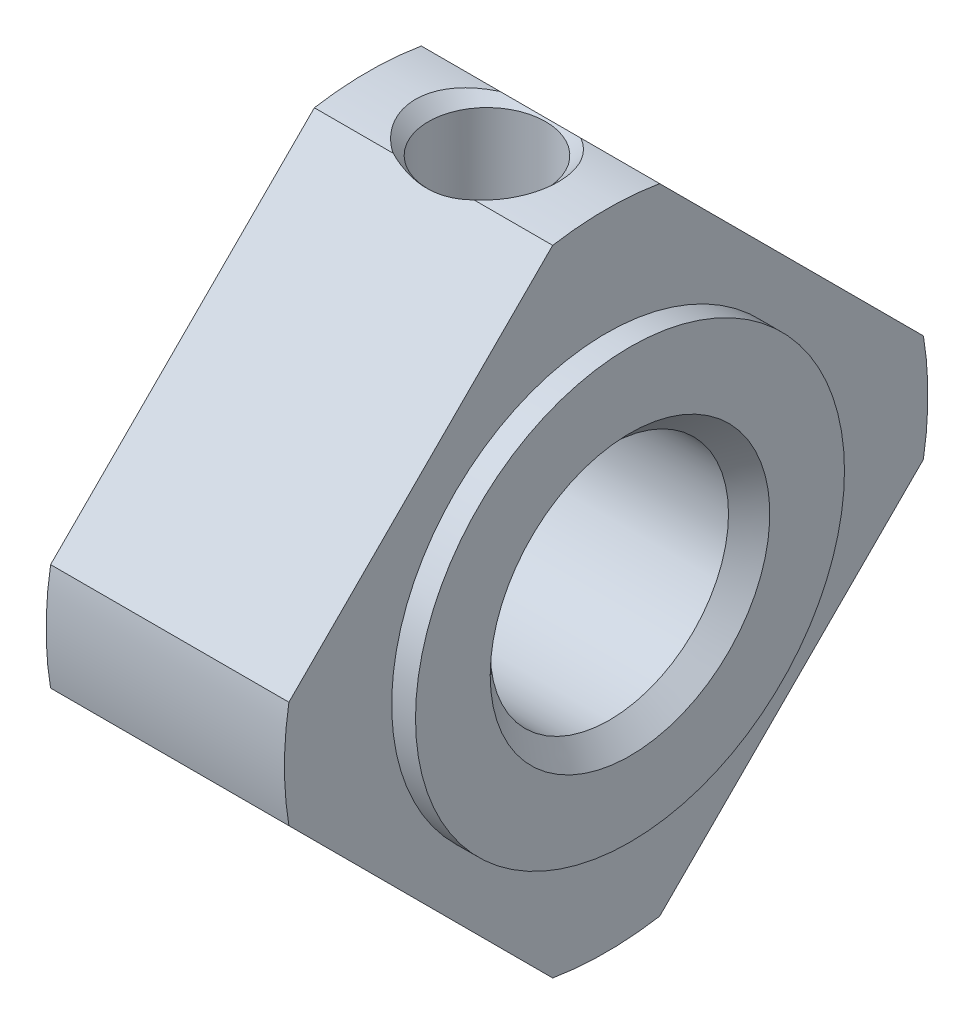
ISO-10303-21;
HEADER;
FILE_DESCRIPTION(('STEP AP214'),'2;1');
FILE_NAME('part.step','',(''),(''),'','','');
FILE_SCHEMA(('AUTOMOTIVE_DESIGN { 1 0 10303 214 1 1 1 1 }'));
ENDSEC;
DATA;
#1=APPLICATION_CONTEXT('core data for automotive mechanical design processes');
#2=APPLICATION_PROTOCOL_DEFINITION('international standard','automotive_design',2000,#1);
#3=PRODUCT_CONTEXT('',#1,'mechanical');
#4=PRODUCT('Part','Part','',(#3));
#5=PRODUCT_RELATED_PRODUCT_CATEGORY('part','',(#4));
#6=PRODUCT_DEFINITION_FORMATION('','',#4);
#7=PRODUCT_DEFINITION_CONTEXT('part definition',#1,'design');
#8=PRODUCT_DEFINITION('design','',#6,#7);
#9=PRODUCT_DEFINITION_SHAPE('','',#8);
#10=(LENGTH_UNIT() NAMED_UNIT(*) SI_UNIT(.MILLI.,.METRE.));
#11=(NAMED_UNIT(*) PLANE_ANGLE_UNIT() SI_UNIT($,.RADIAN.));
#12=(NAMED_UNIT(*) SI_UNIT($,.STERADIAN.) SOLID_ANGLE_UNIT());
#13=UNCERTAINTY_MEASURE_WITH_UNIT(LENGTH_MEASURE(1.E-05),#10,'distance_accuracy_value','');
#14=(GEOMETRIC_REPRESENTATION_CONTEXT(3) GLOBAL_UNCERTAINTY_ASSIGNED_CONTEXT((#13)) GLOBAL_UNIT_ASSIGNED_CONTEXT((#10,
#11,#12)) REPRESENTATION_CONTEXT('',''));
#15=CARTESIAN_POINT('',(0.,0.,0.));
#16=DIRECTION('',(0.,0.,1.));
#17=DIRECTION('',(1.,0.,0.));
#18=AXIS2_PLACEMENT_3D('',#15,#16,#17);
#19=CARTESIAN_POINT('',(5.5,0.,0.));
#20=DIRECTION('',(1.,0.,0.));
#21=DIRECTION('',(0.,0.,-1.));
#22=AXIS2_PLACEMENT_3D('',#19,#20,#21);
#23=CYLINDRICAL_SURFACE('',#22,6.75);
#24=DIRECTION('',(-1.,0.,0.));
#25=VECTOR('',#24,1.);
#26=CARTESIAN_POINT('',(1.65267128542053,6.65608024917335,1.12209434387866));
#27=LINE('',#26,#25);
#28=CARTESIAN_POINT('',(1.65267128542052,6.65608024917335,1.12209434387866));
#29=VERTEX_POINT('',#28);
#30=CARTESIAN_POINT('',(0.,6.65608024917335,1.12209434387865));
#31=VERTEX_POINT('',#30);
#32=EDGE_CURVE('E157',#29,#31,#27,.T.);
#33=ORIENTED_EDGE('',*,*,#32,.F.);
#34=CARTESIAN_POINT('',(2.24603879819354,6.61534751855395,-1.34152058408303));
#35=CARTESIAN_POINT('',(2.15785318177017,6.61815551437171,-1.32767978026441));
#36=CARTESIAN_POINT('',(2.070798662778,6.62239785722063,-1.30659028024299));
#37=CARTESIAN_POINT('',(1.90146823740733,6.63326374287677,-1.25025065235848));
#38=CARTESIAN_POINT('',(1.81919733519108,6.639889728955,-1.21498599036703));
#39=CARTESIAN_POINT('',(1.66224684439875,6.65470509446009,-1.1310209402988));
#40=CARTESIAN_POINT('',(1.58754623527447,6.66288995235655,-1.08235923301763));
#41=CARTESIAN_POINT('',(1.44810106425627,6.67981298110851,-0.972459114140487));
#42=CARTESIAN_POINT('',(1.3833525854404,6.68855093235808,-0.91122567275819));
#43=CARTESIAN_POINT('',(1.26995138541579,6.70491185353518,-0.781455920749189));
#44=CARTESIAN_POINT('',(1.2205795824979,6.71257013615754,-0.713554799184198));
#45=CARTESIAN_POINT('',(1.13543304769278,6.72631468537572,-0.569556578233745));
#46=CARTESIAN_POINT('',(1.09964621172735,6.73240234982073,-0.493466852783167));
#47=CARTESIAN_POINT('',(1.04661821703989,6.74161124659177,-0.343805224457489));
#48=CARTESIAN_POINT('',(1.02783581680782,6.74497507652447,-0.270793929020345));
#49=CARTESIAN_POINT('',(1.00383843306935,6.74929438075554,-0.1225148994005));
#50=CARTESIAN_POINT('',(0.99861518373358,6.75025132231235,-0.0472485682404582));
#51=CARTESIAN_POINT('',(1.00187512401968,6.74965950324262,0.0966900064147446));
#52=CARTESIAN_POINT('',(1.00925627914023,6.74831219353963,0.165390873345387));
#53=CARTESIAN_POINT('',(1.03528869157911,6.74364492933586,0.300541519974863));
#54=CARTESIAN_POINT('',(1.05393954081505,6.74032504626322,0.366991381091963));
#55=CARTESIAN_POINT('',(1.10167849841342,6.73206842345746,0.495918928168141));
#56=CARTESIAN_POINT('',(1.13076992001332,6.72713117050755,0.558395345767164));
#57=CARTESIAN_POINT('',(1.19824470594226,6.71613322382673,0.67798745427871));
#58=CARTESIAN_POINT('',(1.23663052632886,6.71007223324597,0.735101722690727));
#59=CARTESIAN_POINT('',(1.3246340991189,6.69690089303173,0.847013621908955));
#60=CARTESIAN_POINT('',(1.37488142002905,6.68974585693174,0.901310042844061));
#61=CARTESIAN_POINT('',(1.4830676244556,6.67546770454741,1.00159995528784));
#62=CARTESIAN_POINT('',(1.54100965602629,6.66834460256757,1.04759003023828));
#63=CARTESIAN_POINT('',(1.66916081351861,6.65409168785639,1.13477336476352));
#64=CARTESIAN_POINT('',(1.74001719023289,6.64703235540264,1.17502782844539));
#65=CARTESIAN_POINT('',(1.88722547518565,6.63445140224846,1.24410201464943));
#66=CARTESIAN_POINT('',(1.96357927216084,6.6289303132421,1.27291778484392));
#67=CARTESIAN_POINT('',(2.12562506328205,6.61964824769282,1.3203755064781));
#68=CARTESIAN_POINT('',(2.21159122996102,6.61604605774744,1.3381162982316));
#69=CARTESIAN_POINT('',(2.38532642856748,6.61165647428634,1.35963938574428));
#70=CARTESIAN_POINT('',(2.4730957785583,6.61086958172317,1.36341919729776));
#71=CARTESIAN_POINT('',(2.65058632528991,6.61221926110084,1.35686049375444));
#72=CARTESIAN_POINT('',(2.74029234422787,6.61443931670505,1.34611882620944));
#73=CARTESIAN_POINT('',(2.91660266413806,6.62168962844541,1.30998556802453));
#74=CARTESIAN_POINT('',(3.00320658750766,6.62672022546611,1.2845922002991));
#75=CARTESIAN_POINT('',(3.17063896534817,6.63898041092013,1.21964154282177));
#76=CARTESIAN_POINT('',(3.2514754555141,6.64620686297645,1.18010444061909));
#77=CARTESIAN_POINT('',(3.40492192644532,6.66197693635722,1.08754720019126));
#78=CARTESIAN_POINT('',(3.47753225689844,6.67052050165569,1.03452763540652));
#79=CARTESIAN_POINT('',(3.60912601319374,6.68747359811197,0.918418838600742));
#80=CARTESIAN_POINT('',(3.66853702476329,6.69587491288897,0.85581482462203));
#81=CARTESIAN_POINT('',(3.77471514498373,6.71177429450737,0.720555298705765));
#82=CARTESIAN_POINT('',(3.82149151130774,6.71927302044905,0.647907205611915));
#83=CARTESIAN_POINT('',(3.89630734967352,6.7316848353749,0.501781389145373));
#84=CARTESIAN_POINT('',(3.92568006071767,6.73677297123661,0.429002435790604));
#85=CARTESIAN_POINT('',(3.97041223107033,6.74464095907994,0.279149017524704));
#86=CARTESIAN_POINT('',(3.98578328185477,6.74742272025536,0.202078161925788));
#87=CARTESIAN_POINT('',(4.00082204127642,6.7501469132674,0.0541878173701187));
#88=CARTESIAN_POINT('',(4.00190686250625,6.75034554880237,-0.0164857448617568));
#89=CARTESIAN_POINT('',(3.99196060217953,6.74854050922165,-0.15693626696342));
#90=CARTESIAN_POINT('',(3.9809318838276,6.74653726366619,-0.226713399029559));
#91=CARTESIAN_POINT('',(3.94785170860991,6.74065803258112,-0.361136214071014));
#92=CARTESIAN_POINT('',(3.926161469893,6.73684354787529,-0.425874488519602));
#93=CARTESIAN_POINT('',(3.87287364849635,6.72776531670228,-0.551012468439278));
#94=CARTESIAN_POINT('',(3.84127430273643,6.72250131234932,-0.61141139947928));
#95=CARTESIAN_POINT('',(3.76738531747084,6.71071632861456,-0.729735115456749));
#96=CARTESIAN_POINT('',(3.7246115514865,6.70414291760039,-0.787351414657744));
#97=CARTESIAN_POINT('',(3.63080091981482,6.69057831496146,-0.895337833955404));
#98=CARTESIAN_POINT('',(3.57976115906349,6.68358697750627,-0.945705403557404));
#99=CARTESIAN_POINT('',(3.46551945313485,6.66913314238332,-1.04298442893806));
#100=CARTESIAN_POINT('',(3.401616113719,6.66169148561867,-1.08907538653754));
#101=CARTESIAN_POINT('',(3.26739309494876,6.64779335331561,-1.17092756195501));
#102=CARTESIAN_POINT('',(3.19706976317422,6.64133744423409,-1.20668285087359));
#103=CARTESIAN_POINT('',(3.04541857843203,6.62953342641305,-1.27000740242151));
#104=CARTESIAN_POINT('',(2.96366605933838,6.62433136055336,-1.29658868716079));
#105=CARTESIAN_POINT('',(2.79692367246798,6.61639754093793,-1.3364890138674));
#106=CARTESIAN_POINT('',(2.71193597357157,6.61366416153218,-1.34981678396663));
#107=CARTESIAN_POINT('',(2.56302897761604,6.61130072556155,-1.36132941704121));
#108=CARTESIAN_POINT('',(2.49933593269377,6.61105160172571,-1.36253573196111));
#109=CARTESIAN_POINT('',(2.37225019424525,6.61207482800462,-1.35756122028006));
#110=CARTESIAN_POINT('',(2.30885751555298,6.6133472524927,-1.35138003257784));
#111=CARTESIAN_POINT('',(2.24603879819354,6.61534751855395,-1.34152058408303));
#112=B_SPLINE_CURVE_WITH_KNOTS('',3,(#34,#35,#36,#37,#38,#39,#40,#41,#42,#43,#44,#45,#46,#47,
#48,#49,#50,#51,#52,#53,#54,#55,#56,#57,#58,#59,#60,#61,#62,#63,#64,#65,#66,#67,#68,#69,#70,#71,
#72,#73,#74,#75,#76,#77,#78,#79,#80,#81,#82,#83,#84,#85,#86,#87,#88,#89,#90,#91,#92,#93,#94,#95,
#96,#97,#98,#99,#100,#101,#102,#103,#104,#105,#106,#107,#108,#109,#110,#111),.UNSPECIFIED.,.T.,
.F.,(4,2,2,2,2,2,2,2,2,2,2,2,2,2,2,2,2,2,2,2,2,2,2,2,2,2,2,2,2,2,2,2,2,2,2,2,2,2,4),(0.,
0.267700849767893,0.535676882545827,0.802887168670449,1.06999201638941,1.32150050643273,
1.57278437583772,1.79794464672769,2.02296762480854,2.22930698259912,2.43563886916529,
2.6420362915929,2.84848831445894,3.07054138836094,3.29268558994345,3.53703172670496,
3.78146221725689,4.04381955965843,4.30622358346827,4.5760641976223,4.84593754727292,
5.11542722982269,5.38490545226786,5.64364976461629,5.90220397202133,6.13683405320424,
6.37126971549661,6.58225273590439,6.79319460339387,6.99743675327198,7.20171526362097,
7.41699660106674,7.63235350189011,7.86878415887387,8.10535017279106,8.36258211026964,
8.61964453466982,8.81033098343672,9.00102675334229),.UNSPECIFIED.);
#113=CARTESIAN_POINT('',(1.65267128542052,6.65608024917335,-1.12209434387865));
#114=VERTEX_POINT('',#113);
#115=EDGE_CURVE('E143',#114,#29,#112,.T.);
#116=ORIENTED_EDGE('',*,*,#115,.F.);
#117=DIRECTION('',(1.,0.,0.));
#118=VECTOR('',#117,1.);
#119=CARTESIAN_POINT('',(0.,6.65608024917335,-1.12209434387866));
#120=LINE('',#119,#118);
#121=CARTESIAN_POINT('',(0.,6.65608024917335,-1.12209434387865));
#122=VERTEX_POINT('',#121);
#123=EDGE_CURVE('E156',#122,#114,#120,.T.);
#124=ORIENTED_EDGE('',*,*,#123,.F.);
#125=CARTESIAN_POINT('',(0.,0.,0.));
#126=DIRECTION('',(1.,0.,0.));
#127=DIRECTION('',(0.,0.986085962840496,-0.166236199093134));
#128=AXIS2_PLACEMENT_3D('',#125,#126,#127);
#129=CIRCLE('',#128,6.75);
#130=EDGE_CURVE('E167',#122,#31,#129,.T.);
#131=ORIENTED_EDGE('',*,*,#130,.T.);
#132=EDGE_LOOP('',(#33,#116,#124,#131));
#133=FACE_BOUND('',#132,.T.);
#134=ADVANCED_FACE('F63',(#133),#23,.T.);
#135=CARTESIAN_POINT('',(3.34732871457948,6.65608024917335,1.12209434387866));
#136=VERTEX_POINT('',#135);
#137=CARTESIAN_POINT('',(3.34732871457948,6.65608024917335,-1.12209434387866));
#138=VERTEX_POINT('',#137);
#139=EDGE_CURVE('E80',#136,#138,#112,.T.);
#140=ORIENTED_EDGE('',*,*,#139,.F.);
#141=CARTESIAN_POINT('',(5.,6.65608024917335,1.12209434387865));
#142=VERTEX_POINT('',#141);
#143=EDGE_CURVE('E175',#142,#136,#27,.T.);
#144=ORIENTED_EDGE('',*,*,#143,.F.);
#145=CARTESIAN_POINT('',(5.,0.,0.));
#146=DIRECTION('',(1.,0.,0.));
#147=DIRECTION('',(0.,0.986085962840496,-0.166236199093134));
#148=AXIS2_PLACEMENT_3D('',#145,#146,#147);
#149=CIRCLE('',#148,6.75);
#150=CARTESIAN_POINT('',(5.,6.65608024917335,-1.12209434387866));
#151=VERTEX_POINT('',#150);
#152=EDGE_CURVE('E353',#151,#142,#149,.T.);
#153=ORIENTED_EDGE('',*,*,#152,.F.);
#154=EDGE_CURVE('E168',#138,#151,#120,.T.);
#155=ORIENTED_EDGE('',*,*,#154,.F.);
#156=EDGE_LOOP('',(#140,#144,#153,#155));
#157=FACE_BOUND('',#156,.T.);
#158=ADVANCED_FACE('F226',(#157),#23,.T.);
#159=CARTESIAN_POINT('',(5.5,7.778174593052,0.));
#160=DIRECTION('',(0.,-0.707106781186548,-0.707106781186548));
#161=DIRECTION('',(0.,0.707106781186548,-0.707106781186548));
#162=AXIS2_PLACEMENT_3D('',#159,#160,#161);
#163=PLANE('',#162);
#164=ORIENTED_EDGE('',*,*,#143,.T.);
#165=CARTESIAN_POINT('',(3.34792524458136,6.65628024917537,1.12189434387663));
#166=CARTESIAN_POINT('',(3.29280423747889,6.63778277708909,1.14039181596291));
#167=CARTESIAN_POINT('',(3.2366458798352,6.62076058847088,1.15741400458112));
#168=CARTESIAN_POINT('',(3.12242892684439,6.59006400544893,1.18811058760307));
#169=CARTESIAN_POINT('',(3.06436735329143,6.57639517272365,1.20177942032835));
#170=CARTESIAN_POINT('',(2.94696988836248,6.55291987835453,1.22525471469747));
#171=CARTESIAN_POINT('',(2.88764100872699,6.54309610190582,1.23507849114618));
#172=CARTESIAN_POINT('',(2.76794412513807,6.52757870688341,1.25059588616859));
#173=CARTESIAN_POINT('',(2.70757685672463,6.52188227882422,1.25629231422778));
#174=CARTESIAN_POINT('',(2.5897629524755,6.51503373115983,1.26314086189217));
#175=CARTESIAN_POINT('',(2.53234408716051,6.51364296373287,1.26453162931913));
#176=CARTESIAN_POINT('',(2.41758431717266,6.51477955174215,1.26339504130985));
#177=CARTESIAN_POINT('',(2.36024341157082,6.51730686007279,1.26086773297922));
#178=CARTESIAN_POINT('',(2.24619286324717,6.52618435769526,1.25199023535674));
#179=CARTESIAN_POINT('',(2.18948290804976,6.5325325602534,1.2456420327986));
#180=CARTESIAN_POINT('',(2.07713140182352,6.5488280916779,1.2293465013741));
#181=CARTESIAN_POINT('',(2.02148954976025,6.55877439029409,1.21940020275791));
#182=CARTESIAN_POINT('',(1.9125876901768,6.58175304087115,1.19642155218085));
#183=CARTESIAN_POINT('',(1.85930292627979,6.59472740278011,1.1834471902719));
#184=CARTESIAN_POINT('',(1.75441588350486,6.62348307313419,1.15469151991781));
#185=CARTESIAN_POINT('',(1.7028097941963,6.63925741014971,1.13891718290229));
#186=CARTESIAN_POINT('',(1.65207475542466,6.65628024917335,1.12189434387865));
#187=B_SPLINE_CURVE_WITH_KNOTS('',3,(#165,#166,#167,#168,#169,#170,#171,#172,#173,#174,#175,
#176,#177,#178,#179,#180,#181,#182,#183,#184,#185,#186),.UNSPECIFIED.,.F.,.F.,(4,2,2,2,2,2,2,2,
2,2,4),(0.,0.18306054855765,0.36642268855752,0.548949353726212,0.731351655992747,
0.903444542413566,1.07553535984033,1.24753677316517,1.41948897590708,1.58838508246322,
1.75686642087156),.UNSPECIFIED.);
#188=EDGE_CURVE('E159',#136,#29,#187,.T.);
#189=ORIENTED_EDGE('',*,*,#188,.T.);
#190=ORIENTED_EDGE('',*,*,#32,.T.);
#191=DIRECTION('',(0.,-0.707106781186548,0.707106781186548));
#192=VECTOR('',#191,1.);
#193=CARTESIAN_POINT('',(0.,6.65608024917335,1.12209434387865));
#194=LINE('',#193,#192);
#195=CARTESIAN_POINT('',(0.,1.12209434387865,6.65608024917335));
#196=VERTEX_POINT('',#195);
#197=EDGE_CURVE('E173',#31,#196,#194,.T.);
#198=ORIENTED_EDGE('',*,*,#197,.T.);
#199=DIRECTION('',(1.,0.,0.));
#200=VECTOR('',#199,1.);
#201=CARTESIAN_POINT('',(0.,1.12209434387866,6.65608024917335));
#202=LINE('',#201,#200);
#203=CARTESIAN_POINT('',(5.,1.12209434387866,6.65608024917335));
#204=VERTEX_POINT('',#203);
#205=EDGE_CURVE('E264',#196,#204,#202,.T.);
#206=ORIENTED_EDGE('',*,*,#205,.T.);
#207=DIRECTION('',(0.,0.707106781186547,-0.707106781186548));
#208=VECTOR('',#207,1.);
#209=CARTESIAN_POINT('',(5.,1.12209434387865,6.65608024917335));
#210=LINE('',#209,#208);
#211=EDGE_CURVE('E266',#204,#142,#210,.T.);
#212=ORIENTED_EDGE('',*,*,#211,.T.);
#213=EDGE_LOOP('',(#164,#189,#190,#198,#206,#212));
#214=FACE_BOUND('',#213,.T.);
#215=ADVANCED_FACE('F230',(#214),#163,.F.);
#216=CARTESIAN_POINT('',(5.5,0.,-7.778174593052));
#217=DIRECTION('',(0.,-0.707106781186548,0.707106781186548));
#218=DIRECTION('',(0.,-0.707106781186548,-0.707106781186548));
#219=AXIS2_PLACEMENT_3D('',#216,#217,#218);
#220=PLANE('',#219);
#221=ORIENTED_EDGE('',*,*,#123,.T.);
#222=CARTESIAN_POINT('',(1.65207475542466,6.65628024917335,-1.12189434387865));
#223=CARTESIAN_POINT('',(1.70719576252703,6.63778277708724,-1.14039181596476));
#224=CARTESIAN_POINT('',(1.76335412017061,6.62076058846919,-1.15741400458281));
#225=CARTESIAN_POINT('',(1.87757107316119,6.59006400544756,-1.18811058760444));
#226=CARTESIAN_POINT('',(1.93563264671401,6.57639517272244,-1.20177942032956));
#227=CARTESIAN_POINT('',(2.05303011164268,6.55291987835362,-1.22525471469838));
#228=CARTESIAN_POINT('',(2.11235899127801,6.54309610190506,-1.23507849114694));
#229=CARTESIAN_POINT('',(2.23205587486659,6.52757870688292,-1.25059588616908));
#230=CARTESIAN_POINT('',(2.29242314327986,6.52188227882386,-1.25629231422814));
#231=CARTESIAN_POINT('',(2.41023704752867,6.51503373115969,-1.26314086189231));
#232=CARTESIAN_POINT('',(2.46765591284353,6.51364296373282,-1.26453162931918));
#233=CARTESIAN_POINT('',(2.58241568283109,6.51477955174227,-1.26339504130973));
#234=CARTESIAN_POINT('',(2.63975658843279,6.51730686007299,-1.26086773297901));
#235=CARTESIAN_POINT('',(2.75380713675615,6.52618435769559,-1.25199023535641));
#236=CARTESIAN_POINT('',(2.81051709195341,6.5325325602538,-1.2456420327982));
#237=CARTESIAN_POINT('',(2.92286859817935,6.54882809167838,-1.22934650137362));
#238=CARTESIAN_POINT('',(2.97851045024247,6.55877439029461,-1.21940020275739));
#239=CARTESIAN_POINT('',(3.08741230982639,6.58175304087188,-1.19642155218012));
#240=CARTESIAN_POINT('',(3.140697073724,6.59472740278105,-1.18344719027095));
#241=CARTESIAN_POINT('',(3.24558411650008,6.62348307313564,-1.15469151991636));
#242=CARTESIAN_POINT('',(3.29719020580919,6.63925741015143,-1.13891718290057));
#243=CARTESIAN_POINT('',(3.34792524458136,6.65628024917537,-1.12189434387663));
#244=B_SPLINE_CURVE_WITH_KNOTS('',3,(#222,#223,#224,#225,#226,#227,#228,#229,#230,#231,#232,
#233,#234,#235,#236,#237,#238,#239,#240,#241,#242,#243),.UNSPECIFIED.,.F.,.F.,(4,2,2,2,2,2,2,2,
2,2,4),(0.,0.183060548557078,0.366422688556371,0.548949353724461,0.731351655990396,
0.903444542410801,1.07553535983715,1.24753677316159,1.41948897590311,1.58838508246124,
1.75686642087156),.UNSPECIFIED.);
#245=EDGE_CURVE('E140',#114,#138,#244,.T.);
#246=ORIENTED_EDGE('',*,*,#245,.T.);
#247=ORIENTED_EDGE('',*,*,#154,.T.);
#248=DIRECTION('',(0.,-0.707106781186548,-0.707106781186548));
#249=VECTOR('',#248,1.);
#250=CARTESIAN_POINT('',(5.,6.65608024917335,-1.12209434387865));
#251=LINE('',#250,#249);
#252=CARTESIAN_POINT('',(5.,1.12209434387865,-6.65608024917335));
#253=VERTEX_POINT('',#252);
#254=EDGE_CURVE('E418',#151,#253,#251,.T.);
#255=ORIENTED_EDGE('',*,*,#254,.T.);
#256=DIRECTION('',(-1.,0.,0.));
#257=VECTOR('',#256,1.);
#258=CARTESIAN_POINT('',(5.,1.12209434387866,-6.65608024917335));
#259=LINE('',#258,#257);
#260=CARTESIAN_POINT('',(0.,1.12209434387865,-6.65608024917335));
#261=VERTEX_POINT('',#260);
#262=EDGE_CURVE('E281',#253,#261,#259,.T.);
#263=ORIENTED_EDGE('',*,*,#262,.T.);
#264=DIRECTION('',(0.,0.707106781186548,0.707106781186548));
#265=VECTOR('',#264,1.);
#266=CARTESIAN_POINT('',(0.,1.12209434387865,-6.65608024917335));
#267=LINE('',#266,#265);
#268=EDGE_CURVE('E165',#261,#122,#267,.T.);
#269=ORIENTED_EDGE('',*,*,#268,.T.);
#270=EDGE_LOOP('',(#221,#246,#247,#255,#263,#269));
#271=FACE_BOUND('',#270,.T.);
#272=ADVANCED_FACE('F162',(#271),#220,.F.);
#273=CARTESIAN_POINT('',(0.,6.75,0.));
#274=DIRECTION('',(-1.,0.,0.));
#275=DIRECTION('',(0.,0.,1.));
#276=AXIS2_PLACEMENT_3D('',#273,#274,#275);
#277=PLANE('',#276);
#278=CARTESIAN_POINT('',(0.,0.,0.));
#279=DIRECTION('',(-1.,0.,0.));
#280=DIRECTION('',(0.,0.,1.));
#281=AXIS2_PLACEMENT_3D('',#278,#279,#280);
#282=CIRCLE('',#281,2.93300000000002);
#283=CARTESIAN_POINT('',(0.,0.,2.93300000000002));
#284=VERTEX_POINT('',#283);
#285=EDGE_CURVE('E13',#284,#284,#282,.F.);
#286=ORIENTED_EDGE('',*,*,#285,.T.);
#287=EDGE_LOOP('',(#286));
#288=FACE_BOUND('',#287,.T.);
#289=ORIENTED_EDGE('',*,*,#197,.F.);
#290=ORIENTED_EDGE('',*,*,#130,.F.);
#291=ORIENTED_EDGE('',*,*,#268,.F.);
#292=CARTESIAN_POINT('',(0.,0.,0.));
#293=DIRECTION('',(1.,0.,0.));
#294=DIRECTION('',(0.,-0.166236199093134,-0.986085962840496));
#295=AXIS2_PLACEMENT_3D('',#292,#293,#294);
#296=CIRCLE('',#295,6.75);
#297=CARTESIAN_POINT('',(0.,-1.12209434387865,-6.65608024917335));
#298=VERTEX_POINT('',#297);
#299=EDGE_CURVE('E403',#298,#261,#296,.T.);
#300=ORIENTED_EDGE('',*,*,#299,.F.);
#301=DIRECTION('',(0.,0.707106781186548,-0.707106781186548));
#302=VECTOR('',#301,1.);
#303=CARTESIAN_POINT('',(0.,-6.65608024917335,-1.12209434387865));
#304=LINE('',#303,#302);
#305=CARTESIAN_POINT('',(0.,-6.65608024917335,-1.12209434387865));
#306=VERTEX_POINT('',#305);
#307=EDGE_CURVE('E397',#306,#298,#304,.T.);
#308=ORIENTED_EDGE('',*,*,#307,.F.);
#309=CARTESIAN_POINT('',(0.,0.,0.));
#310=DIRECTION('',(1.,0.,0.));
#311=DIRECTION('',(0.,-0.986085962840496,0.166236199093135));
#312=AXIS2_PLACEMENT_3D('',#309,#310,#311);
#313=CIRCLE('',#312,6.75);
#314=CARTESIAN_POINT('',(0.,-6.65608024917335,1.12209434387865));
#315=VERTEX_POINT('',#314);
#316=EDGE_CURVE('E391',#315,#306,#313,.T.);
#317=ORIENTED_EDGE('',*,*,#316,.F.);
#318=DIRECTION('',(0.,-0.707106781186548,-0.707106781186548));
#319=VECTOR('',#318,1.);
#320=CARTESIAN_POINT('',(0.,-1.12209434387865,6.65608024917335));
#321=LINE('',#320,#319);
#322=CARTESIAN_POINT('',(0.,-1.12209434387865,6.65608024917335));
#323=VERTEX_POINT('',#322);
#324=EDGE_CURVE('E341',#323,#315,#321,.T.);
#325=ORIENTED_EDGE('',*,*,#324,.F.);
#326=CARTESIAN_POINT('',(0.,0.,0.));
#327=DIRECTION('',(1.,0.,0.));
#328=DIRECTION('',(0.,0.166236199093134,0.986085962840496));
#329=AXIS2_PLACEMENT_3D('',#326,#327,#328);
#330=CIRCLE('',#329,6.75);
#331=EDGE_CURVE('E379',#196,#323,#330,.T.);
#332=ORIENTED_EDGE('',*,*,#331,.F.);
#333=EDGE_LOOP('',(#289,#290,#291,#300,#308,#317,#325,#332));
#334=FACE_BOUND('',#333,.T.);
#335=ADVANCED_FACE('F527',(#288,#334),#277,.T.);
#336=ORIENTED_EDGE('',*,*,#205,.F.);
#337=ORIENTED_EDGE('',*,*,#331,.T.);
#338=DIRECTION('',(-1.,0.,0.));
#339=VECTOR('',#338,1.);
#340=CARTESIAN_POINT('',(5.,-1.12209434387866,6.65608024917335));
#341=LINE('',#340,#339);
#342=CARTESIAN_POINT('',(5.,-1.12209434387866,6.65608024917335));
#343=VERTEX_POINT('',#342);
#344=EDGE_CURVE('E373',#343,#323,#341,.T.);
#345=ORIENTED_EDGE('',*,*,#344,.F.);
#346=CARTESIAN_POINT('',(5.,0.,0.));
#347=DIRECTION('',(1.,0.,0.));
#348=DIRECTION('',(0.,0.166236199093135,0.986085962840496));
#349=AXIS2_PLACEMENT_3D('',#346,#347,#348);
#350=CIRCLE('',#349,6.75);
#351=EDGE_CURVE('E351',#204,#343,#350,.T.);
#352=ORIENTED_EDGE('',*,*,#351,.F.);
#353=EDGE_LOOP('',(#336,#337,#345,#352));
#354=FACE_BOUND('',#353,.T.);
#355=ADVANCED_FACE('F232',(#354),#23,.T.);
#356=CARTESIAN_POINT('',(5.,4.5,0.));
#357=DIRECTION('',(1.,0.,0.));
#358=DIRECTION('',(0.,0.,-1.));
#359=AXIS2_PLACEMENT_3D('',#356,#357,#358);
#360=PLANE('',#359);
#361=CARTESIAN_POINT('',(5.,0.,0.));
#362=DIRECTION('',(1.,0.,0.));
#363=DIRECTION('',(0.,0.,-1.));
#364=AXIS2_PLACEMENT_3D('',#361,#362,#363);
#365=CIRCLE('',#364,4.5);
#366=CARTESIAN_POINT('',(5.,0.,-4.5));
#367=VERTEX_POINT('',#366);
#368=EDGE_CURVE('E469',#367,#367,#365,.F.);
#369=ORIENTED_EDGE('',*,*,#368,.T.);
#370=EDGE_LOOP('',(#369));
#371=FACE_BOUND('',#370,.T.);
#372=ORIENTED_EDGE('',*,*,#254,.F.);
#373=ORIENTED_EDGE('',*,*,#152,.T.);
#374=ORIENTED_EDGE('',*,*,#211,.F.);
#375=ORIENTED_EDGE('',*,*,#351,.T.);
#376=DIRECTION('',(0.,0.707106781186548,0.707106781186548));
#377=VECTOR('',#376,1.);
#378=CARTESIAN_POINT('',(5.,-6.65608024917335,1.12209434387865));
#379=LINE('',#378,#377);
#380=CARTESIAN_POINT('',(5.,-6.65608024917335,1.12209434387866));
#381=VERTEX_POINT('',#380);
#382=EDGE_CURVE('E338',#381,#343,#379,.T.);
#383=ORIENTED_EDGE('',*,*,#382,.F.);
#384=CARTESIAN_POINT('',(5.,0.,0.));
#385=DIRECTION('',(1.,0.,0.));
#386=DIRECTION('',(0.,-0.986085962840496,0.166236199093135));
#387=AXIS2_PLACEMENT_3D('',#384,#385,#386);
#388=CIRCLE('',#387,6.75);
#389=CARTESIAN_POINT('',(5.,-6.65608024917335,-1.12209434387866));
#390=VERTEX_POINT('',#389);
#391=EDGE_CURVE('E311',#381,#390,#388,.T.);
#392=ORIENTED_EDGE('',*,*,#391,.T.);
#393=DIRECTION('',(0.,-0.707106781186548,0.707106781186548));
#394=VECTOR('',#393,1.);
#395=CARTESIAN_POINT('',(5.,-1.12209434387865,-6.65608024917335));
#396=LINE('',#395,#394);
#397=CARTESIAN_POINT('',(5.,-1.12209434387866,-6.65608024917335));
#398=VERTEX_POINT('',#397);
#399=EDGE_CURVE('E313',#398,#390,#396,.T.);
#400=ORIENTED_EDGE('',*,*,#399,.F.);
#401=CARTESIAN_POINT('',(5.,0.,0.));
#402=DIRECTION('',(1.,0.,0.));
#403=DIRECTION('',(0.,-0.166236199093135,-0.986085962840496));
#404=AXIS2_PLACEMENT_3D('',#401,#402,#403);
#405=CIRCLE('',#404,6.75);
#406=EDGE_CURVE('E317',#398,#253,#405,.T.);
#407=ORIENTED_EDGE('',*,*,#406,.T.);
#408=EDGE_LOOP('',(#372,#373,#374,#375,#383,#392,#400,#407));
#409=FACE_BOUND('',#408,.T.);
#410=ADVANCED_FACE('F349',(#371,#409),#360,.T.);
#411=ORIENTED_EDGE('',*,*,#262,.F.);
#412=ORIENTED_EDGE('',*,*,#406,.F.);
#413=DIRECTION('',(1.,0.,0.));
#414=VECTOR('',#413,1.);
#415=CARTESIAN_POINT('',(0.,-1.12209434387866,-6.65608024917335));
#416=LINE('',#415,#414);
#417=EDGE_CURVE('E88',#298,#398,#416,.T.);
#418=ORIENTED_EDGE('',*,*,#417,.F.);
#419=ORIENTED_EDGE('',*,*,#299,.T.);
#420=EDGE_LOOP('',(#411,#412,#418,#419));
#421=FACE_BOUND('',#420,.T.);
#422=ADVANCED_FACE('F505',(#421),#23,.T.);
#423=CARTESIAN_POINT('',(5.5,-7.778174593052,0.));
#424=DIRECTION('',(0.,0.707106781186548,0.707106781186548));
#425=DIRECTION('',(0.,-0.707106781186548,0.707106781186548));
#426=AXIS2_PLACEMENT_3D('',#423,#424,#425);
#427=PLANE('',#426);
#428=DIRECTION('',(-1.,0.,0.));
#429=VECTOR('',#428,1.);
#430=CARTESIAN_POINT('',(5.,-6.65608024917335,-1.12209434387866));
#431=LINE('',#430,#429);
#432=EDGE_CURVE('E296',#390,#306,#431,.T.);
#433=ORIENTED_EDGE('',*,*,#432,.T.);
#434=ORIENTED_EDGE('',*,*,#307,.T.);
#435=ORIENTED_EDGE('',*,*,#417,.T.);
#436=ORIENTED_EDGE('',*,*,#399,.T.);
#437=EDGE_LOOP('',(#433,#434,#435,#436));
#438=FACE_BOUND('',#437,.T.);
#439=ADVANCED_FACE('F504',(#438),#427,.F.);
#440=ORIENTED_EDGE('',*,*,#432,.F.);
#441=ORIENTED_EDGE('',*,*,#391,.F.);
#442=DIRECTION('',(1.,0.,0.));
#443=VECTOR('',#442,1.);
#444=CARTESIAN_POINT('',(0.,-6.65608024917335,1.12209434387866));
#445=LINE('',#444,#443);
#446=EDGE_CURVE('E150',#315,#381,#445,.T.);
#447=ORIENTED_EDGE('',*,*,#446,.F.);
#448=ORIENTED_EDGE('',*,*,#316,.T.);
#449=EDGE_LOOP('',(#440,#441,#447,#448));
#450=FACE_BOUND('',#449,.T.);
#451=ADVANCED_FACE('F355',(#450),#23,.T.);
#452=CARTESIAN_POINT('',(5.5,0.,7.778174593052));
#453=DIRECTION('',(0.,0.707106781186548,-0.707106781186548));
#454=DIRECTION('',(0.,0.707106781186548,0.707106781186548));
#455=AXIS2_PLACEMENT_3D('',#452,#453,#454);
#456=PLANE('',#455);
#457=ORIENTED_EDGE('',*,*,#344,.T.);
#458=ORIENTED_EDGE('',*,*,#324,.T.);
#459=ORIENTED_EDGE('',*,*,#446,.T.);
#460=ORIENTED_EDGE('',*,*,#382,.T.);
#461=EDGE_LOOP('',(#457,#458,#459,#460));
#462=FACE_BOUND('',#461,.T.);
#463=ADVANCED_FACE('F337',(#462),#456,.F.);
#464=CARTESIAN_POINT('',(-7.72792206135786,0.,0.));
#465=DIRECTION('',(1.,0.,0.));
#466=DIRECTION('',(0.,0.,-1.));
#467=AXIS2_PLACEMENT_3D('',#464,#465,#466);
#468=CYLINDRICAL_SURFACE('',#467,4.5);
#469=ORIENTED_EDGE('',*,*,#368,.F.);
#470=EDGE_LOOP('',(#469));
#471=FACE_BOUND('',#470,.T.);
#472=CARTESIAN_POINT('',(5.5,0.,0.));
#473=DIRECTION('',(1.,0.,0.));
#474=DIRECTION('',(0.,0.,1.));
#475=AXIS2_PLACEMENT_3D('',#472,#473,#474);
#476=CIRCLE('',#475,4.5);
#477=CARTESIAN_POINT('',(5.5,0.,4.5));
#478=VERTEX_POINT('',#477);
#479=EDGE_CURVE('E726',#478,#478,#476,.T.);
#480=ORIENTED_EDGE('',*,*,#479,.F.);
#481=EDGE_LOOP('',(#480));
#482=FACE_BOUND('',#481,.T.);
#483=ADVANCED_FACE('F233',(#471,#482),#468,.T.);
#484=CARTESIAN_POINT('',(5.5,0.,0.));
#485=DIRECTION('',(-1.,0.,0.));
#486=DIRECTION('',(0.,0.,1.));
#487=AXIS2_PLACEMENT_3D('',#484,#485,#486);
#488=PLANE('',#487);
#489=CARTESIAN_POINT('',(5.5,0.,0.));
#490=DIRECTION('',(-1.,0.,0.));
#491=DIRECTION('',(0.,0.,1.));
#492=AXIS2_PLACEMENT_3D('',#489,#490,#491);
#493=CIRCLE('',#492,2.93300000000001);
#494=CARTESIAN_POINT('',(5.5,0.,2.93300000000001));
#495=VERTEX_POINT('',#494);
#496=EDGE_CURVE('E73',#495,#495,#493,.T.);
#497=ORIENTED_EDGE('',*,*,#496,.T.);
#498=EDGE_LOOP('',(#497));
#499=FACE_BOUND('',#498,.T.);
#500=ORIENTED_EDGE('',*,*,#479,.T.);
#501=EDGE_LOOP('',(#500));
#502=FACE_BOUND('',#501,.T.);
#503=ADVANCED_FACE('F653',(#499,#502),#488,.F.);
#504=CARTESIAN_POINT('',(5.501,0.,0.));
#505=DIRECTION('',(-1.,0.,0.));
#506=DIRECTION('',(0.,0.,1.));
#507=AXIS2_PLACEMENT_3D('',#504,#505,#506);
#508=CYLINDRICAL_SURFACE('',#507,2.5);
#509=CARTESIAN_POINT('',(5.06699999999999,0.,0.));
#510=DIRECTION('',(-1.,0.,0.));
#511=DIRECTION('',(0.,0.,1.));
#512=AXIS2_PLACEMENT_3D('',#509,#510,#511);
#513=CIRCLE('',#512,2.5);
#514=CARTESIAN_POINT('',(5.06699999999999,0.,2.5));
#515=VERTEX_POINT('',#514);
#516=EDGE_CURVE('E746',#515,#515,#513,.F.);
#517=ORIENTED_EDGE('',*,*,#516,.T.);
#518=EDGE_LOOP('',(#517));
#519=FACE_BOUND('',#518,.T.);
#520=CARTESIAN_POINT('',(0.433000000000014,0.,0.));
#521=DIRECTION('',(-1.,0.,0.));
#522=DIRECTION('',(0.,0.,1.));
#523=AXIS2_PLACEMENT_3D('',#520,#521,#522);
#524=CIRCLE('',#523,2.5);
#525=CARTESIAN_POINT('',(0.433000000000014,0.,2.5));
#526=VERTEX_POINT('',#525);
#527=EDGE_CURVE('E149',#526,#526,#524,.T.);
#528=ORIENTED_EDGE('',*,*,#527,.T.);
#529=EDGE_LOOP('',(#528));
#530=FACE_BOUND('',#529,.T.);
#531=CARTESIAN_POINT('',(2.5,2.17677048629386,-1.2295));
#532=CARTESIAN_POINT('',(2.43577157965054,2.17677578477281,-1.22949567603831));
#533=CARTESIAN_POINT('',(2.37145840161485,2.17965613127623,-1.22443373564332));
#534=CARTESIAN_POINT('',(2.24479296186269,2.19076511977838,-1.20443802978489));
#535=CARTESIAN_POINT('',(2.18244526348724,2.19900536665854,-1.1894828429574));
#536=CARTESIAN_POINT('',(2.06178049434796,2.21964982106771,-1.15049288244603));
#537=CARTESIAN_POINT('',(2.00344436421692,2.23203242174291,-1.12650514337545));
#538=CARTESIAN_POINT('',(1.89163886446666,2.25953301614397,-1.07027430140568));
#539=CARTESIAN_POINT('',(1.83816961993367,2.27465108014549,-1.03803098640703));
#540=CARTESIAN_POINT('',(1.73290921309165,2.3073920945376,-0.96319105589198));
#541=CARTESIAN_POINT('',(1.68159095423238,2.32511864855142,-0.919974340812396));
#542=CARTESIAN_POINT('',(1.58656498240778,2.36024183474851,-0.825705223797949));
#543=CARTESIAN_POINT('',(1.54286096186909,2.37763830323748,-0.774649042667674));
#544=CARTESIAN_POINT('',(1.46153942300686,2.41148805301282,-0.662111759830688));
#545=CARTESIAN_POINT('',(1.42449857287542,2.42780750797796,-0.600169916725054));
#546=CARTESIAN_POINT('',(1.36157797349174,2.45632763167845,-0.469981452088291));
#547=CARTESIAN_POINT('',(1.33569140498105,2.46853081593453,-0.401738713738439));
#548=CARTESIAN_POINT('',(1.29767038465962,2.48669812919369,-0.26589155505911));
#549=CARTESIAN_POINT('',(1.28470809767051,2.49303563135054,-0.198569883084163));
#550=CARTESIAN_POINT('',(1.2701826485084,2.50014754841693,-0.0624315436238655));
#551=CARTESIAN_POINT('',(1.26861284478198,2.50092520458377,0.00638422935997318));
#552=CARTESIAN_POINT('',(1.27658529460569,2.4970114095747,0.137355324561392));
#553=CARTESIAN_POINT('',(1.28520306373557,2.49277493337475,0.199583587425359));
#554=CARTESIAN_POINT('',(1.31165896649324,2.47999000195402,0.32157751857906));
#555=CARTESIAN_POINT('',(1.32949778835595,2.47144122487569,0.381343002693965));
#556=CARTESIAN_POINT('',(1.37401940944104,2.45066728865061,0.497775066556948));
#557=CARTESIAN_POINT('',(1.4008239398625,2.43839175419107,0.554385738103421));
#558=CARTESIAN_POINT('',(1.46235522020839,2.41128063708328,0.662445269391631));
#559=CARTESIAN_POINT('',(1.4970848338226,2.39644412951319,0.713892253561072));
#560=CARTESIAN_POINT('',(1.57716491658394,2.36399939359176,0.815224939173351));
#561=CARTESIAN_POINT('',(1.62319951481388,2.34626173437661,0.864529040870136));
#562=CARTESIAN_POINT('',(1.7227439931001,2.3109071357489,0.955025334965638));
#563=CARTESIAN_POINT('',(1.77625925277105,2.29329029286998,0.996211637731079));
#564=CARTESIAN_POINT('',(1.89318262553734,2.25903811194194,1.07171295926343));
#565=CARTESIAN_POINT('',(1.9569913931846,2.2425248517817,1.10546831979465));
#566=CARTESIAN_POINT('',(2.09038839394562,2.21402136988789,1.16151111416587));
#567=CARTESIAN_POINT('',(2.15997067798962,2.20202656123413,1.1838101863077));
#568=CARTESIAN_POINT('',(2.29719196264242,2.18522310291627,1.21453126486853));
#569=CARTESIAN_POINT('',(2.3645561040228,2.17992506876643,1.22390361582539));
#570=CARTESIAN_POINT('',(2.50008742973265,2.17571958580807,1.23136818919575));
#571=CARTESIAN_POINT('',(2.56825405861162,2.17680794945379,1.22946780310708));
#572=CARTESIAN_POINT('',(2.6958961500224,2.18473415235663,1.21531307007751));
#573=CARTESIAN_POINT('',(2.75553746114942,2.19096146722198,1.20415754159092));
#574=CARTESIAN_POINT('',(2.8719956843156,2.20757429471399,1.17342172153825));
#575=CARTESIAN_POINT('',(2.92881171175825,2.21796110057637,1.15383880965598));
#576=CARTESIAN_POINT('',(3.04100028888366,2.24229086091557,1.10584115883859));
#577=CARTESIAN_POINT('',(3.09618336454172,2.25637652545819,1.07705860264962));
#578=CARTESIAN_POINT('',(3.20125178639368,2.28638221414764,1.01180305697916));
#579=CARTESIAN_POINT('',(3.25113440655533,2.302303173498,0.975326138787442));
#580=CARTESIAN_POINT('',(3.35050540629355,2.33650488623315,0.890547969281478));
#581=CARTESIAN_POINT('',(3.39921394934577,2.35483785989399,0.841349600017137));
#582=CARTESIAN_POINT('',(3.48791770975632,2.39011576473906,0.735170333697024));
#583=CARTESIAN_POINT('',(3.52791028289974,2.40706027372645,0.678187083402165));
#584=CARTESIAN_POINT('',(3.5988105256981,2.43817034984067,0.556212373445873));
#585=CARTESIAN_POINT('',(3.62948583191873,2.45226230312163,0.491065760619434));
#586=CARTESIAN_POINT('',(3.67914182473642,2.47552428578934,0.355645146989717));
#587=CARTESIAN_POINT('',(3.69813244821317,2.48469849646164,0.285375559910458));
#588=CARTESIAN_POINT('',(3.72229311354851,2.49644369158283,0.148517610673094));
#589=CARTESIAN_POINT('',(3.72855118181735,2.49953370230837,0.0821653994041289));
#590=CARTESIAN_POINT('',(3.73024751400786,2.50036729947071,-0.0507015142390305));
#591=CARTESIAN_POINT('',(3.72568931889951,2.49811263561851,-0.117216156315824));
#592=CARTESIAN_POINT('',(3.70661557835031,2.48881280949547,-0.244156656258369));
#593=CARTESIAN_POINT('',(3.69273920156548,2.48207539270445,-0.304703445078503));
#594=CARTESIAN_POINT('',(3.65626667938988,2.4647566874324,-0.422518922449893));
#595=CARTESIAN_POINT('',(3.63366924376144,2.45417483019894,-0.479787124510087));
#596=CARTESIAN_POINT('',(3.57935823963063,2.42955413606576,-0.592219221508783));
#597=CARTESIAN_POINT('',(3.54728997682307,2.41538462396106,-0.64718231755628));
#598=CARTESIAN_POINT('',(3.47539777480865,2.38509292957185,-0.751179317764917));
#599=CARTESIAN_POINT('',(3.43557026410778,2.36896984937902,-0.800210474610425));
#600=CARTESIAN_POINT('',(3.34482120586829,2.3345498637693,-0.89593932593475));
#601=CARTESIAN_POINT('',(3.29319956782695,2.31619343676598,-0.941953864582263));
#602=CARTESIAN_POINT('',(3.18265676989454,2.28070453217253,-1.02490379971784));
#603=CARTESIAN_POINT('',(3.1237295674233,2.26357308650405,-1.06183160401926));
#604=CARTESIAN_POINT('',(2.99811540019695,2.23218633257751,-1.12635219651385));
#605=CARTESIAN_POINT('',(2.93126314651844,2.21802012200815,-1.15366913997149));
#606=CARTESIAN_POINT('',(2.79303089853435,2.1953595965793,-1.1962413576225));
#607=CARTESIAN_POINT('',(2.72166695611406,2.18684629005014,-1.21153705090943));
#608=CARTESIAN_POINT('',(2.62464277706255,2.18019396355339,-1.2234218188025));
#609=CARTESIAN_POINT('',(2.59979101049453,2.17891433517126,-1.22569784953065));
#610=CARTESIAN_POINT('',(2.54996377755157,2.17720153873151,-1.2287378296906));
#611=CARTESIAN_POINT('',(2.52498830335473,2.17676842490112,-1.22950168225321));
#612=CARTESIAN_POINT('',(2.5,2.17677048629386,-1.2295));
#613=B_SPLINE_CURVE_WITH_KNOTS('',3,(#531,#532,#533,#534,#535,#536,#537,#538,#539,#540,#541,
#542,#543,#544,#545,#546,#547,#548,#549,#550,#551,#552,#553,#554,#555,#556,#557,#558,#559,#560,
#561,#562,#563,#564,#565,#566,#567,#568,#569,#570,#571,#572,#573,#574,#575,#576,#577,#578,#579,
#580,#581,#582,#583,#584,#585,#586,#587,#588,#589,#590,#591,#592,#593,#594,#595,#596,#597,#598,
#599,#600,#601,#602,#603,#604,#605,#606,#607,#608,#609,#610,#611,#612),.UNSPECIFIED.,.T.,.F.,(4,
2,2,2,2,2,2,2,2,2,2,2,2,2,2,2,2,2,2,2,2,2,2,2,2,2,2,2,2,2,2,2,2,2,2,2,2,2,2,2,4),(0.,
0.192580175732901,0.385578706777902,0.577585843527017,0.769597913753682,0.97690428705383,
1.18431091276645,1.40513537879893,1.6258246498356,1.83123896452729,2.03653351781269,
2.22454267582913,2.41256586837708,2.60325321150315,2.79400956797831,3.00235895872482,
3.21085895935151,3.43185325712993,3.65262260338025,3.85609543140499,4.0594348576977,
4.24159951831491,4.4238208601409,4.61450199283324,4.80528072324143,5.01917124170217,
5.23312655933436,5.45204697150888,5.67078095128508,5.86987095279382,6.06889578628379,
6.25549992963017,6.44213169072982,6.63690550028795,6.83176917474926,7.04546008301269,
7.25932893353865,7.47891327110501,7.6977561026392,7.77267532975101,7.84759935598639),.UNSPECIFIED.);
#614=CARTESIAN_POINT('',(2.5,2.17677048629386,-1.2295));
#615=VERTEX_POINT('',#614);
#616=EDGE_CURVE('E185',#615,#615,#613,.T.);
#617=ORIENTED_EDGE('',*,*,#616,.T.);
#618=EDGE_LOOP('',(#617));
#619=FACE_BOUND('',#618,.T.);
#620=ADVANCED_FACE('F206',(#519,#530,#619),#508,.F.);
#621=CARTESIAN_POINT('',(2.5,6.4795,0.));
#622=DIRECTION('',(0.,1.,0.));
#623=DIRECTION('',(0.,0.,1.));
#624=AXIS2_PLACEMENT_3D('',#621,#622,#623);
#625=CONICAL_SURFACE('',#624,1.2295,0.785398163397448);
#626=CARTESIAN_POINT('',(2.5,6.4795,0.));
#627=DIRECTION('',(0.,-1.,0.));
#628=DIRECTION('',(0.,0.,-1.));
#629=AXIS2_PLACEMENT_3D('',#626,#627,#628);
#630=CIRCLE('',#629,1.2295);
#631=CARTESIAN_POINT('',(2.5,6.4795,-1.2295));
#632=VERTEX_POINT('',#631);
#633=EDGE_CURVE('E220',#632,#632,#630,.T.);
#634=ORIENTED_EDGE('',*,*,#633,.T.);
#635=EDGE_LOOP('',(#634));
#636=FACE_BOUND('',#635,.T.);
#637=ORIENTED_EDGE('',*,*,#188,.F.);
#638=ORIENTED_EDGE('',*,*,#139,.T.);
#639=ORIENTED_EDGE('',*,*,#245,.F.);
#640=ORIENTED_EDGE('',*,*,#115,.T.);
#641=EDGE_LOOP('',(#637,#638,#639,#640));
#642=FACE_BOUND('',#641,.T.);
#643=ADVANCED_FACE('F142',(#636,#642),#625,.F.);
#644=CARTESIAN_POINT('',(2.5,6.74999998998455,0.));
#645=DIRECTION('',(0.,-1.,0.));
#646=DIRECTION('',(0.,0.,-1.));
#647=AXIS2_PLACEMENT_3D('',#644,#645,#646);
#648=CYLINDRICAL_SURFACE('',#647,1.2295);
#649=ORIENTED_EDGE('',*,*,#633,.F.);
#650=EDGE_LOOP('',(#649));
#651=FACE_BOUND('',#650,.T.);
#652=ORIENTED_EDGE('',*,*,#616,.F.);
#653=EDGE_LOOP('',(#652));
#654=FACE_BOUND('',#653,.T.);
#655=ADVANCED_FACE('F205',(#651,#654),#648,.F.);
#656=CARTESIAN_POINT('',(5.06699999999999,0.,0.));
#657=DIRECTION('',(1.,0.,0.));
#658=DIRECTION('',(0.,0.,-1.));
#659=AXIS2_PLACEMENT_3D('',#656,#657,#658);
#660=CONICAL_SURFACE('',#659,2.5,0.785398163397451);
#661=ORIENTED_EDGE('',*,*,#496,.F.);
#662=EDGE_LOOP('',(#661));
#663=FACE_BOUND('',#662,.T.);
#664=ORIENTED_EDGE('',*,*,#516,.F.);
#665=EDGE_LOOP('',(#664));
#666=FACE_BOUND('',#665,.T.);
#667=ADVANCED_FACE('F674',(#663,#666),#660,.F.);
#668=CARTESIAN_POINT('',(0.433000000000014,0.,0.));
#669=DIRECTION('',(-1.,0.,0.));
#670=DIRECTION('',(0.,0.,1.));
#671=AXIS2_PLACEMENT_3D('',#668,#669,#670);
#672=CONICAL_SURFACE('',#671,2.5,0.785398163397451);
#673=ORIENTED_EDGE('',*,*,#285,.F.);
#674=EDGE_LOOP('',(#673));
#675=FACE_BOUND('',#674,.T.);
#676=ORIENTED_EDGE('',*,*,#527,.F.);
#677=EDGE_LOOP('',(#676));
#678=FACE_BOUND('',#677,.T.);
#679=ADVANCED_FACE('F66',(#675,#678),#672,.F.);
#680=CLOSED_SHELL('',(#134,#158,#215,#272,#335,#355,#410,#422,#439,#451,#463,#483,#503,#620,
#643,#655,#667,#679));
#681=MANIFOLD_SOLID_BREP('B2',#680);
#682=ADVANCED_BREP_SHAPE_REPRESENTATION('',(#18,#681),#14);
#683=SHAPE_DEFINITION_REPRESENTATION(#9,#682);
ENDSEC;
END-ISO-10303-21;
